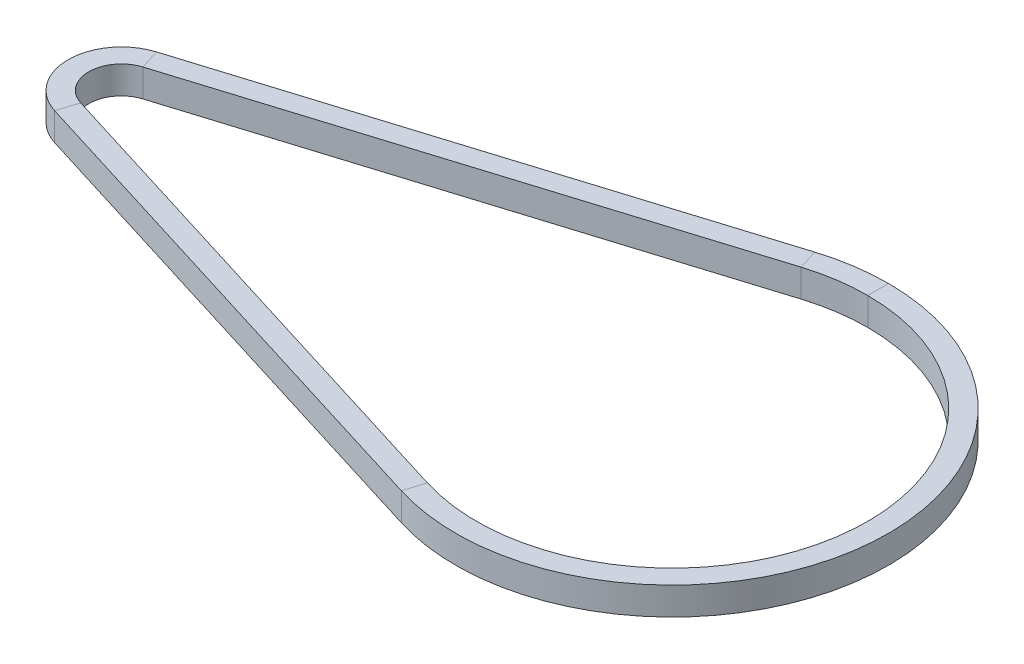
ISO-10303-21;
HEADER;
FILE_DESCRIPTION(('STEP AP214'),'2;1');
FILE_NAME('part.step','',(''),(''),'','','');
FILE_SCHEMA(('AUTOMOTIVE_DESIGN { 1 0 10303 214 1 1 1 1 }'));
ENDSEC;
DATA;
#1=APPLICATION_CONTEXT('core data for automotive mechanical design processes');
#2=APPLICATION_PROTOCOL_DEFINITION('international standard','automotive_design',2000,#1);
#3=PRODUCT_CONTEXT('',#1,'mechanical');
#4=PRODUCT('Part','Part','',(#3));
#5=PRODUCT_RELATED_PRODUCT_CATEGORY('part','',(#4));
#6=PRODUCT_DEFINITION_FORMATION('','',#4);
#7=PRODUCT_DEFINITION_CONTEXT('part definition',#1,'design');
#8=PRODUCT_DEFINITION('design','',#6,#7);
#9=PRODUCT_DEFINITION_SHAPE('','',#8);
#10=(LENGTH_UNIT() NAMED_UNIT(*) SI_UNIT(.MILLI.,.METRE.));
#11=(NAMED_UNIT(*) PLANE_ANGLE_UNIT() SI_UNIT($,.RADIAN.));
#12=(NAMED_UNIT(*) SI_UNIT($,.STERADIAN.) SOLID_ANGLE_UNIT());
#13=UNCERTAINTY_MEASURE_WITH_UNIT(LENGTH_MEASURE(1.E-05),#10,'distance_accuracy_value','');
#14=(GEOMETRIC_REPRESENTATION_CONTEXT(3) GLOBAL_UNCERTAINTY_ASSIGNED_CONTEXT((#13)) GLOBAL_UNIT_ASSIGNED_CONTEXT((#10,
#11,#12)) REPRESENTATION_CONTEXT('',''));
#15=CARTESIAN_POINT('',(0.,0.,0.));
#16=DIRECTION('',(0.,0.,1.));
#17=DIRECTION('',(1.,0.,0.));
#18=AXIS2_PLACEMENT_3D('',#15,#16,#17);
#19=CARTESIAN_POINT('',(70.2498163522013,-2.,-29.8390968777877));
#20=DIRECTION('',(0.,-1.,0.));
#21=DIRECTION('',(0.,0.,-1.));
#22=AXIS2_PLACEMENT_3D('',#19,#20,#21);
#23=PLANE('',#22);
#24=CARTESIAN_POINT('',(79.5,-2.,0.));
#25=DIRECTION('',(0.,-1.,0.));
#26=DIRECTION('',(-0.296100628930817,0.,-0.955156750249285));
#27=AXIS2_PLACEMENT_3D('',#24,#25,#26);
#28=CIRCLE('',#27,28.24);
#29=CARTESIAN_POINT('',(71.1381182389937,-2.,-26.9736266270398));
#30=VERTEX_POINT('',#29);
#31=CARTESIAN_POINT('',(79.5,-2.,-28.24));
#32=VERTEX_POINT('',#31);
#33=EDGE_CURVE('E11',#30,#32,#28,.T.);
#34=ORIENTED_EDGE('',*,*,#33,.F.);
#35=DIRECTION('',(-0.296100628930818,0.,-0.955156750249285));
#36=VECTOR('',#35,1.);
#37=CARTESIAN_POINT('',(70.2498163522013,-2.,-29.8390968777877));
#38=LINE('',#37,#36);
#39=CARTESIAN_POINT('',(70.2498163522013,-2.,-29.8390968777877));
#40=VERTEX_POINT('',#39);
#41=EDGE_CURVE('E36',#30,#40,#38,.T.);
#42=ORIENTED_EDGE('',*,*,#41,.T.);
#43=CARTESIAN_POINT('',(79.5,-2.,0.));
#44=DIRECTION('',(0.,-1.,0.));
#45=DIRECTION('',(-0.296100628930817,0.,-0.955156750249285));
#46=AXIS2_PLACEMENT_3D('',#43,#44,#45);
#47=CIRCLE('',#46,31.24);
#48=CARTESIAN_POINT('',(79.5,-2.,-31.24));
#49=VERTEX_POINT('',#48);
#50=EDGE_CURVE('E133',#40,#49,#47,.T.);
#51=ORIENTED_EDGE('',*,*,#50,.T.);
#52=DIRECTION('',(0.,0.,-1.));
#53=VECTOR('',#52,1.);
#54=CARTESIAN_POINT('',(79.5,-2.,-31.24));
#55=LINE('',#54,#53);
#56=EDGE_CURVE('E136',#32,#49,#55,.T.);
#57=ORIENTED_EDGE('',*,*,#56,.F.);
#58=EDGE_LOOP('',(#34,#42,#51,#57));
#59=FACE_BOUND('',#58,.T.);
#60=ADVANCED_FACE('F33',(#59),#23,.T.);
#61=CARTESIAN_POINT('',(79.5,0.,0.));
#62=DIRECTION('',(0.,-1.,0.));
#63=DIRECTION('',(0.,0.,-1.));
#64=AXIS2_PLACEMENT_3D('',#61,#62,#63);
#65=CYLINDRICAL_SURFACE('',#64,28.24);
#66=CARTESIAN_POINT('',(79.5,2.,0.));
#67=DIRECTION('',(0.,-1.,0.));
#68=DIRECTION('',(-0.296100628930817,0.,-0.955156750249285));
#69=AXIS2_PLACEMENT_3D('',#66,#67,#68);
#70=CIRCLE('',#69,28.24);
#71=CARTESIAN_POINT('',(71.1381182389937,2.,-26.9736266270398));
#72=VERTEX_POINT('',#71);
#73=CARTESIAN_POINT('',(79.5,2.,-28.24));
#74=VERTEX_POINT('',#73);
#75=EDGE_CURVE('E41',#72,#74,#70,.T.);
#76=ORIENTED_EDGE('',*,*,#75,.F.);
#77=DIRECTION('',(0.,-1.,0.));
#78=VECTOR('',#77,1.);
#79=CARTESIAN_POINT('',(71.1381182389937,-2.,-26.9736266270398));
#80=LINE('',#79,#78);
#81=EDGE_CURVE('E219',#72,#30,#80,.T.);
#82=ORIENTED_EDGE('',*,*,#81,.T.);
#83=ORIENTED_EDGE('',*,*,#33,.T.);
#84=DIRECTION('',(0.,-1.,0.));
#85=VECTOR('',#84,1.);
#86=CARTESIAN_POINT('',(79.5,-2.,-28.24));
#87=LINE('',#86,#85);
#88=EDGE_CURVE('E160',#74,#32,#87,.T.);
#89=ORIENTED_EDGE('',*,*,#88,.F.);
#90=EDGE_LOOP('',(#76,#82,#83,#89));
#91=FACE_BOUND('',#90,.T.);
#92=ADVANCED_FACE('F265',(#91),#65,.F.);
#93=CARTESIAN_POINT('',(70.2498163522013,2.,-29.8390968777877));
#94=DIRECTION('',(0.,1.,0.));
#95=DIRECTION('',(0.,0.,1.));
#96=AXIS2_PLACEMENT_3D('',#93,#94,#95);
#97=PLANE('',#96);
#98=CARTESIAN_POINT('',(79.5,2.,0.));
#99=DIRECTION('',(0.,-1.,0.));
#100=DIRECTION('',(-0.296100628930817,0.,-0.955156750249285));
#101=AXIS2_PLACEMENT_3D('',#98,#99,#100);
#102=CIRCLE('',#101,31.24);
#103=CARTESIAN_POINT('',(70.2498163522013,2.,-29.8390968777877));
#104=VERTEX_POINT('',#103);
#105=CARTESIAN_POINT('',(79.5,2.,-31.24));
#106=VERTEX_POINT('',#105);
#107=EDGE_CURVE('E142',#104,#106,#102,.T.);
#108=ORIENTED_EDGE('',*,*,#107,.F.);
#109=DIRECTION('',(0.296100628930818,0.,0.955156750249285));
#110=VECTOR('',#109,1.);
#111=CARTESIAN_POINT('',(70.2498163522013,2.,-29.8390968777877));
#112=LINE('',#111,#110);
#113=EDGE_CURVE('E197',#104,#72,#112,.T.);
#114=ORIENTED_EDGE('',*,*,#113,.T.);
#115=ORIENTED_EDGE('',*,*,#75,.T.);
#116=DIRECTION('',(0.,0.,1.));
#117=VECTOR('',#116,1.);
#118=CARTESIAN_POINT('',(79.5,2.,-31.24));
#119=LINE('',#118,#117);
#120=EDGE_CURVE('E164',#106,#74,#119,.T.);
#121=ORIENTED_EDGE('',*,*,#120,.F.);
#122=EDGE_LOOP('',(#108,#114,#115,#121));
#123=FACE_BOUND('',#122,.T.);
#124=ADVANCED_FACE('F269',(#123),#97,.T.);
#125=CARTESIAN_POINT('',(-2.27997484276729,-2.,-7.35470697691949));
#126=DIRECTION('',(0.,-1.,0.));
#127=DIRECTION('',(0.,0.,-1.));
#128=AXIS2_PLACEMENT_3D('',#125,#126,#127);
#129=PLANE('',#128);
#130=ORIENTED_EDGE('',*,*,#41,.F.);
#131=DIRECTION('',(0.955156750249285,0.,-0.296100628930818));
#132=VECTOR('',#131,1.);
#133=CARTESIAN_POINT('',(-1.39167295597484,-2.,-4.48923672617164));
#134=LINE('',#133,#132);
#135=CARTESIAN_POINT('',(-1.39167295597484,-2.,-4.48923672617163));
#136=VERTEX_POINT('',#135);
#137=EDGE_CURVE('E82',#136,#30,#134,.T.);
#138=ORIENTED_EDGE('',*,*,#137,.F.);
#139=DIRECTION('',(-0.296100628930818,0.,-0.955156750249285));
#140=VECTOR('',#139,1.);
#141=CARTESIAN_POINT('',(-2.27997484276729,-2.,-7.35470697691949));
#142=LINE('',#141,#140);
#143=CARTESIAN_POINT('',(-2.27997484276729,-2.,-7.35470697691949));
#144=VERTEX_POINT('',#143);
#145=EDGE_CURVE('E200',#136,#144,#142,.T.);
#146=ORIENTED_EDGE('',*,*,#145,.T.);
#147=DIRECTION('',(0.955156750249285,0.,-0.296100628930818));
#148=VECTOR('',#147,1.);
#149=CARTESIAN_POINT('',(-2.27997484276729,-2.,-7.35470697691949));
#150=LINE('',#149,#148);
#151=EDGE_CURVE('E195',#144,#40,#150,.T.);
#152=ORIENTED_EDGE('',*,*,#151,.T.);
#153=EDGE_LOOP('',(#130,#138,#146,#152));
#154=FACE_BOUND('',#153,.T.);
#155=ADVANCED_FACE('F238',(#154),#129,.T.);
#156=CARTESIAN_POINT('',(-1.39167295597484,-2.,-4.48923672617164));
#157=DIRECTION('',(0.296100628930818,0.,0.955156750249285));
#158=DIRECTION('',(0.955156750249285,0.,-0.296100628930818));
#159=AXIS2_PLACEMENT_3D('',#156,#157,#158);
#160=PLANE('',#159);
#161=ORIENTED_EDGE('',*,*,#137,.T.);
#162=ORIENTED_EDGE('',*,*,#81,.F.);
#163=DIRECTION('',(0.955156750249285,0.,-0.296100628930818));
#164=VECTOR('',#163,1.);
#165=CARTESIAN_POINT('',(-1.39167295597484,2.,-4.48923672617164));
#166=LINE('',#165,#164);
#167=CARTESIAN_POINT('',(-1.39167295597484,2.,-4.48923672617163));
#168=VERTEX_POINT('',#167);
#169=EDGE_CURVE('E91',#168,#72,#166,.T.);
#170=ORIENTED_EDGE('',*,*,#169,.F.);
#171=DIRECTION('',(0.,-1.,0.));
#172=VECTOR('',#171,1.);
#173=CARTESIAN_POINT('',(-1.39167295597484,-2.,-4.48923672617163));
#174=LINE('',#173,#172);
#175=EDGE_CURVE('E215',#168,#136,#174,.T.);
#176=ORIENTED_EDGE('',*,*,#175,.T.);
#177=EDGE_LOOP('',(#161,#162,#170,#176));
#178=FACE_BOUND('',#177,.T.);
#179=ADVANCED_FACE('F266',(#178),#160,.T.);
#180=CARTESIAN_POINT('',(-2.27997484276729,2.,-7.35470697691949));
#181=DIRECTION('',(0.,1.,0.));
#182=DIRECTION('',(0.,0.,1.));
#183=AXIS2_PLACEMENT_3D('',#180,#181,#182);
#184=PLANE('',#183);
#185=ORIENTED_EDGE('',*,*,#169,.T.);
#186=ORIENTED_EDGE('',*,*,#113,.F.);
#187=DIRECTION('',(0.955156750249285,0.,-0.296100628930818));
#188=VECTOR('',#187,1.);
#189=CARTESIAN_POINT('',(-2.27997484276729,2.,-7.35470697691949));
#190=LINE('',#189,#188);
#191=CARTESIAN_POINT('',(-2.27997484276729,2.,-7.35470697691949));
#192=VERTEX_POINT('',#191);
#193=EDGE_CURVE('E99',#192,#104,#190,.T.);
#194=ORIENTED_EDGE('',*,*,#193,.F.);
#195=DIRECTION('',(0.296100628930818,0.,0.955156750249285));
#196=VECTOR('',#195,1.);
#197=CARTESIAN_POINT('',(-2.27997484276729,2.,-7.35470697691949));
#198=LINE('',#197,#196);
#199=EDGE_CURVE('E189',#192,#168,#198,.T.);
#200=ORIENTED_EDGE('',*,*,#199,.T.);
#201=EDGE_LOOP('',(#185,#186,#194,#200));
#202=FACE_BOUND('',#201,.T.);
#203=ADVANCED_FACE('F267',(#202),#184,.T.);
#204=CARTESIAN_POINT('',(-2.27997484276729,-2.,-7.35470697691949));
#205=DIRECTION('',(-0.296100628930818,0.,-0.955156750249285));
#206=DIRECTION('',(-0.955156750249285,0.,0.296100628930818));
#207=AXIS2_PLACEMENT_3D('',#204,#205,#206);
#208=PLANE('',#207);
#209=ORIENTED_EDGE('',*,*,#193,.T.);
#210=DIRECTION('',(0.,1.,0.));
#211=VECTOR('',#210,1.);
#212=CARTESIAN_POINT('',(70.2498163522013,-2.,-29.8390968777877));
#213=LINE('',#212,#211);
#214=EDGE_CURVE('E193',#40,#104,#213,.T.);
#215=ORIENTED_EDGE('',*,*,#214,.F.);
#216=ORIENTED_EDGE('',*,*,#151,.F.);
#217=DIRECTION('',(0.,1.,0.));
#218=VECTOR('',#217,1.);
#219=CARTESIAN_POINT('',(-2.27997484276729,-2.,-7.35470697691949));
#220=LINE('',#219,#218);
#221=EDGE_CURVE('E182',#144,#192,#220,.T.);
#222=ORIENTED_EDGE('',*,*,#221,.T.);
#223=EDGE_LOOP('',(#209,#215,#216,#222));
#224=FACE_BOUND('',#223,.T.);
#225=ADVANCED_FACE('F313',(#224),#208,.T.);
#226=CARTESIAN_POINT('',(-2.27997484276729,-2.,7.35470697691949));
#227=DIRECTION('',(0.,-1.,0.));
#228=DIRECTION('',(0.,0.,-1.));
#229=AXIS2_PLACEMENT_3D('',#226,#227,#228);
#230=PLANE('',#229);
#231=ORIENTED_EDGE('',*,*,#145,.F.);
#232=CARTESIAN_POINT('',(0.,-2.,0.));
#233=DIRECTION('',(0.,-1.,0.));
#234=DIRECTION('',(-0.296100628930817,0.,0.955156750249285));
#235=AXIS2_PLACEMENT_3D('',#232,#233,#234);
#236=CIRCLE('',#235,4.7);
#237=CARTESIAN_POINT('',(-1.39167295597484,-2.,4.48923672617164));
#238=VERTEX_POINT('',#237);
#239=EDGE_CURVE('E229',#238,#136,#236,.T.);
#240=ORIENTED_EDGE('',*,*,#239,.F.);
#241=DIRECTION('',(-0.296100628930818,0.,0.955156750249285));
#242=VECTOR('',#241,1.);
#243=CARTESIAN_POINT('',(-2.27997484276729,-2.,7.35470697691949));
#244=LINE('',#243,#242);
#245=CARTESIAN_POINT('',(-2.27997484276729,-2.,7.3547069769195));
#246=VERTEX_POINT('',#245);
#247=EDGE_CURVE('E192',#238,#246,#244,.T.);
#248=ORIENTED_EDGE('',*,*,#247,.T.);
#249=CARTESIAN_POINT('',(0.,-2.,0.));
#250=DIRECTION('',(0.,-1.,0.));
#251=DIRECTION('',(-0.296100628930817,0.,0.955156750249285));
#252=AXIS2_PLACEMENT_3D('',#249,#250,#251);
#253=CIRCLE('',#252,7.69999999999999);
#254=EDGE_CURVE('E186',#246,#144,#253,.T.);
#255=ORIENTED_EDGE('',*,*,#254,.T.);
#256=EDGE_LOOP('',(#231,#240,#248,#255));
#257=FACE_BOUND('',#256,.T.);
#258=ADVANCED_FACE('F245',(#257),#230,.T.);
#259=CARTESIAN_POINT('',(0.,0.,0.));
#260=DIRECTION('',(0.,-1.,0.));
#261=DIRECTION('',(0.,0.,-1.));
#262=AXIS2_PLACEMENT_3D('',#259,#260,#261);
#263=CYLINDRICAL_SURFACE('',#262,4.7);
#264=ORIENTED_EDGE('',*,*,#239,.T.);
#265=ORIENTED_EDGE('',*,*,#175,.F.);
#266=CARTESIAN_POINT('',(0.,2.,0.));
#267=DIRECTION('',(0.,-1.,0.));
#268=DIRECTION('',(-0.296100628930817,0.,0.955156750249285));
#269=AXIS2_PLACEMENT_3D('',#266,#267,#268);
#270=CIRCLE('',#269,4.7);
#271=CARTESIAN_POINT('',(-1.39167295597484,2.,4.48923672617164));
#272=VERTEX_POINT('',#271);
#273=EDGE_CURVE('E212',#272,#168,#270,.T.);
#274=ORIENTED_EDGE('',*,*,#273,.F.);
#275=DIRECTION('',(0.,-1.,0.));
#276=VECTOR('',#275,1.);
#277=CARTESIAN_POINT('',(-1.39167295597484,-2.,4.48923672617164));
#278=LINE('',#277,#276);
#279=EDGE_CURVE('E209',#272,#238,#278,.T.);
#280=ORIENTED_EDGE('',*,*,#279,.T.);
#281=EDGE_LOOP('',(#264,#265,#274,#280));
#282=FACE_BOUND('',#281,.T.);
#283=ADVANCED_FACE('F329',(#282),#263,.F.);
#284=CARTESIAN_POINT('',(-2.27997484276729,2.,7.35470697691949));
#285=DIRECTION('',(0.,1.,0.));
#286=DIRECTION('',(0.,0.,1.));
#287=AXIS2_PLACEMENT_3D('',#284,#285,#286);
#288=PLANE('',#287);
#289=ORIENTED_EDGE('',*,*,#273,.T.);
#290=ORIENTED_EDGE('',*,*,#199,.F.);
#291=CARTESIAN_POINT('',(0.,2.,0.));
#292=DIRECTION('',(0.,-1.,0.));
#293=DIRECTION('',(-0.296100628930817,0.,0.955156750249285));
#294=AXIS2_PLACEMENT_3D('',#291,#292,#293);
#295=CIRCLE('',#294,7.69999999999999);
#296=CARTESIAN_POINT('',(-2.27997484276729,2.,7.3547069769195));
#297=VERTEX_POINT('',#296);
#298=EDGE_CURVE('E185',#297,#192,#295,.T.);
#299=ORIENTED_EDGE('',*,*,#298,.F.);
#300=DIRECTION('',(0.296100628930818,0.,-0.955156750249285));
#301=VECTOR('',#300,1.);
#302=CARTESIAN_POINT('',(-2.27997484276729,2.,7.35470697691949));
#303=LINE('',#302,#301);
#304=EDGE_CURVE('E176',#297,#272,#303,.T.);
#305=ORIENTED_EDGE('',*,*,#304,.T.);
#306=EDGE_LOOP('',(#289,#290,#299,#305));
#307=FACE_BOUND('',#306,.T.);
#308=ADVANCED_FACE('F259',(#307),#288,.T.);
#309=CARTESIAN_POINT('',(0.,0.,0.));
#310=DIRECTION('',(0.,-1.,0.));
#311=DIRECTION('',(0.,0.,-1.));
#312=AXIS2_PLACEMENT_3D('',#309,#310,#311);
#313=CYLINDRICAL_SURFACE('',#312,7.69999999999999);
#314=ORIENTED_EDGE('',*,*,#298,.T.);
#315=ORIENTED_EDGE('',*,*,#221,.F.);
#316=ORIENTED_EDGE('',*,*,#254,.F.);
#317=DIRECTION('',(0.,1.,0.));
#318=VECTOR('',#317,1.);
#319=CARTESIAN_POINT('',(-2.27997484276729,-2.,7.35470697691949));
#320=LINE('',#319,#318);
#321=EDGE_CURVE('E173',#246,#297,#320,.T.);
#322=ORIENTED_EDGE('',*,*,#321,.T.);
#323=EDGE_LOOP('',(#314,#315,#316,#322));
#324=FACE_BOUND('',#323,.T.);
#325=ADVANCED_FACE('F243',(#324),#313,.T.);
#326=CARTESIAN_POINT('',(70.2498163522013,-2.,29.8390968777877));
#327=DIRECTION('',(0.,-1.,0.));
#328=DIRECTION('',(0.,0.,-1.));
#329=AXIS2_PLACEMENT_3D('',#326,#327,#328);
#330=PLANE('',#329);
#331=ORIENTED_EDGE('',*,*,#247,.F.);
#332=DIRECTION('',(-0.955156750249285,0.,-0.296100628930818));
#333=VECTOR('',#332,1.);
#334=CARTESIAN_POINT('',(71.1381182389937,-2.,26.9736266270398));
#335=LINE('',#334,#333);
#336=CARTESIAN_POINT('',(71.1381182389937,-2.,26.9736266270398));
#337=VERTEX_POINT('',#336);
#338=EDGE_CURVE('E177',#337,#238,#335,.T.);
#339=ORIENTED_EDGE('',*,*,#338,.F.);
#340=DIRECTION('',(-0.296100628930817,0.,0.955156750249285));
#341=VECTOR('',#340,1.);
#342=CARTESIAN_POINT('',(70.2498163522013,-2.,29.8390968777877));
#343=LINE('',#342,#341);
#344=CARTESIAN_POINT('',(70.2498163522013,-2.,29.8390968777877));
#345=VERTEX_POINT('',#344);
#346=EDGE_CURVE('E181',#337,#345,#343,.T.);
#347=ORIENTED_EDGE('',*,*,#346,.T.);
#348=DIRECTION('',(-0.955156750249285,0.,-0.296100628930818));
#349=VECTOR('',#348,1.);
#350=CARTESIAN_POINT('',(70.2498163522013,-2.,29.8390968777877));
#351=LINE('',#350,#349);
#352=EDGE_CURVE('E179',#345,#246,#351,.T.);
#353=ORIENTED_EDGE('',*,*,#352,.T.);
#354=EDGE_LOOP('',(#331,#339,#347,#353));
#355=FACE_BOUND('',#354,.T.);
#356=ADVANCED_FACE('F249',(#355),#330,.T.);
#357=CARTESIAN_POINT('',(71.1381182389937,-2.,26.9736266270398));
#358=DIRECTION('',(0.296100628930818,0.,-0.955156750249285));
#359=DIRECTION('',(-0.955156750249285,0.,-0.296100628930818));
#360=AXIS2_PLACEMENT_3D('',#357,#358,#359);
#361=PLANE('',#360);
#362=ORIENTED_EDGE('',*,*,#338,.T.);
#363=ORIENTED_EDGE('',*,*,#279,.F.);
#364=DIRECTION('',(-0.955156750249285,0.,-0.296100628930818));
#365=VECTOR('',#364,1.);
#366=CARTESIAN_POINT('',(71.1381182389937,2.,26.9736266270398));
#367=LINE('',#366,#365);
#368=CARTESIAN_POINT('',(71.1381182389937,2.,26.9736266270398));
#369=VERTEX_POINT('',#368);
#370=EDGE_CURVE('E114',#369,#272,#367,.T.);
#371=ORIENTED_EDGE('',*,*,#370,.F.);
#372=DIRECTION('',(0.,-1.,0.));
#373=VECTOR('',#372,1.);
#374=CARTESIAN_POINT('',(71.1381182389937,-2.,26.9736266270398));
#375=LINE('',#374,#373);
#376=EDGE_CURVE('E206',#369,#337,#375,.T.);
#377=ORIENTED_EDGE('',*,*,#376,.T.);
#378=EDGE_LOOP('',(#362,#363,#371,#377));
#379=FACE_BOUND('',#378,.T.);
#380=ADVANCED_FACE('F255',(#379),#361,.T.);
#381=CARTESIAN_POINT('',(70.2498163522013,2.,29.8390968777877));
#382=DIRECTION('',(0.,1.,0.));
#383=DIRECTION('',(0.,0.,1.));
#384=AXIS2_PLACEMENT_3D('',#381,#382,#383);
#385=PLANE('',#384);
#386=ORIENTED_EDGE('',*,*,#370,.T.);
#387=ORIENTED_EDGE('',*,*,#304,.F.);
#388=DIRECTION('',(-0.955156750249285,0.,-0.296100628930818));
#389=VECTOR('',#388,1.);
#390=CARTESIAN_POINT('',(70.2498163522013,2.,29.8390968777877));
#391=LINE('',#390,#389);
#392=CARTESIAN_POINT('',(70.2498163522013,2.,29.8390968777877));
#393=VERTEX_POINT('',#392);
#394=EDGE_CURVE('E121',#393,#297,#391,.T.);
#395=ORIENTED_EDGE('',*,*,#394,.F.);
#396=DIRECTION('',(0.296100628930817,0.,-0.955156750249285));
#397=VECTOR('',#396,1.);
#398=CARTESIAN_POINT('',(70.2498163522013,2.,29.8390968777877));
#399=LINE('',#398,#397);
#400=EDGE_CURVE('E171',#393,#369,#399,.T.);
#401=ORIENTED_EDGE('',*,*,#400,.T.);
#402=EDGE_LOOP('',(#386,#387,#395,#401));
#403=FACE_BOUND('',#402,.T.);
#404=ADVANCED_FACE('F260',(#403),#385,.T.);
#405=CARTESIAN_POINT('',(70.2498163522013,-2.,29.8390968777877));
#406=DIRECTION('',(-0.296100628930818,0.,0.955156750249285));
#407=DIRECTION('',(0.955156750249285,0.,0.296100628930818));
#408=AXIS2_PLACEMENT_3D('',#405,#406,#407);
#409=PLANE('',#408);
#410=ORIENTED_EDGE('',*,*,#394,.T.);
#411=ORIENTED_EDGE('',*,*,#321,.F.);
#412=ORIENTED_EDGE('',*,*,#352,.F.);
#413=DIRECTION('',(0.,1.,0.));
#414=VECTOR('',#413,1.);
#415=CARTESIAN_POINT('',(70.2498163522013,-2.,29.8390968777877));
#416=LINE('',#415,#414);
#417=EDGE_CURVE('E152',#345,#393,#416,.T.);
#418=ORIENTED_EDGE('',*,*,#417,.T.);
#419=EDGE_LOOP('',(#410,#411,#412,#418));
#420=FACE_BOUND('',#419,.T.);
#421=ADVANCED_FACE('F248',(#420),#409,.T.);
#422=CARTESIAN_POINT('',(79.5,-2.,-31.24));
#423=DIRECTION('',(0.,-1.,0.));
#424=DIRECTION('',(0.,0.,-1.));
#425=AXIS2_PLACEMENT_3D('',#422,#423,#424);
#426=PLANE('',#425);
#427=ORIENTED_EDGE('',*,*,#346,.F.);
#428=CARTESIAN_POINT('',(79.5,-2.,0.));
#429=DIRECTION('',(0.,-1.,0.));
#430=DIRECTION('',(0.,0.,-1.));
#431=AXIS2_PLACEMENT_3D('',#428,#429,#430);
#432=CIRCLE('',#431,28.24);
#433=EDGE_CURVE('E159',#32,#337,#432,.T.);
#434=ORIENTED_EDGE('',*,*,#433,.F.);
#435=ORIENTED_EDGE('',*,*,#56,.T.);
#436=CARTESIAN_POINT('',(79.5,-2.,0.));
#437=DIRECTION('',(0.,-1.,0.));
#438=DIRECTION('',(0.,0.,-1.));
#439=AXIS2_PLACEMENT_3D('',#436,#437,#438);
#440=CIRCLE('',#439,31.24);
#441=EDGE_CURVE('E148',#49,#345,#440,.T.);
#442=ORIENTED_EDGE('',*,*,#441,.T.);
#443=EDGE_LOOP('',(#427,#434,#435,#442));
#444=FACE_BOUND('',#443,.T.);
#445=ADVANCED_FACE('F157',(#444),#426,.T.);
#446=CARTESIAN_POINT('',(79.5,0.,0.));
#447=DIRECTION('',(0.,-1.,0.));
#448=DIRECTION('',(0.,0.,-1.));
#449=AXIS2_PLACEMENT_3D('',#446,#447,#448);
#450=CYLINDRICAL_SURFACE('',#449,28.24);
#451=ORIENTED_EDGE('',*,*,#433,.T.);
#452=ORIENTED_EDGE('',*,*,#376,.F.);
#453=CARTESIAN_POINT('',(79.5,2.,0.));
#454=DIRECTION('',(0.,-1.,0.));
#455=DIRECTION('',(0.,0.,-1.));
#456=AXIS2_PLACEMENT_3D('',#453,#454,#455);
#457=CIRCLE('',#456,28.24);
#458=EDGE_CURVE('E203',#74,#369,#457,.T.);
#459=ORIENTED_EDGE('',*,*,#458,.F.);
#460=ORIENTED_EDGE('',*,*,#88,.T.);
#461=EDGE_LOOP('',(#451,#452,#459,#460));
#462=FACE_BOUND('',#461,.T.);
#463=ADVANCED_FACE('F252',(#462),#450,.F.);
#464=CARTESIAN_POINT('',(79.5,2.,-31.24));
#465=DIRECTION('',(0.,1.,0.));
#466=DIRECTION('',(0.,0.,1.));
#467=AXIS2_PLACEMENT_3D('',#464,#465,#466);
#468=PLANE('',#467);
#469=ORIENTED_EDGE('',*,*,#458,.T.);
#470=ORIENTED_EDGE('',*,*,#400,.F.);
#471=CARTESIAN_POINT('',(79.5,2.,0.));
#472=DIRECTION('',(0.,-1.,0.));
#473=DIRECTION('',(0.,0.,-1.));
#474=AXIS2_PLACEMENT_3D('',#471,#472,#473);
#475=CIRCLE('',#474,31.24);
#476=EDGE_CURVE('E170',#106,#393,#475,.T.);
#477=ORIENTED_EDGE('',*,*,#476,.F.);
#478=ORIENTED_EDGE('',*,*,#120,.T.);
#479=EDGE_LOOP('',(#469,#470,#477,#478));
#480=FACE_BOUND('',#479,.T.);
#481=ADVANCED_FACE('F263',(#480),#468,.T.);
#482=CARTESIAN_POINT('',(79.5,0.,0.));
#483=DIRECTION('',(0.,-1.,0.));
#484=DIRECTION('',(0.,0.,-1.));
#485=AXIS2_PLACEMENT_3D('',#482,#483,#484);
#486=CYLINDRICAL_SURFACE('',#485,31.24);
#487=ORIENTED_EDGE('',*,*,#476,.T.);
#488=ORIENTED_EDGE('',*,*,#417,.F.);
#489=ORIENTED_EDGE('',*,*,#441,.F.);
#490=DIRECTION('',(0.,1.,0.));
#491=VECTOR('',#490,1.);
#492=CARTESIAN_POINT('',(79.5,-2.,-31.24));
#493=LINE('',#492,#491);
#494=EDGE_CURVE('E151',#49,#106,#493,.T.);
#495=ORIENTED_EDGE('',*,*,#494,.T.);
#496=EDGE_LOOP('',(#487,#488,#489,#495));
#497=FACE_BOUND('',#496,.T.);
#498=ADVANCED_FACE('F150',(#497),#486,.T.);
#499=CARTESIAN_POINT('',(79.5,0.,0.));
#500=DIRECTION('',(0.,-1.,0.));
#501=DIRECTION('',(0.,0.,-1.));
#502=AXIS2_PLACEMENT_3D('',#499,#500,#501);
#503=CYLINDRICAL_SURFACE('',#502,31.24);
#504=ORIENTED_EDGE('',*,*,#214,.T.);
#505=ORIENTED_EDGE('',*,*,#107,.T.);
#506=ORIENTED_EDGE('',*,*,#494,.F.);
#507=ORIENTED_EDGE('',*,*,#50,.F.);
#508=EDGE_LOOP('',(#504,#505,#506,#507));
#509=FACE_BOUND('',#508,.T.);
#510=ADVANCED_FACE('F162',(#509),#503,.T.);
#511=CLOSED_SHELL('',(#60,#92,#124,#155,#179,#203,#225,#258,#283,#308,#325,#356,#380,#404,#421,
#445,#463,#481,#498,#510));
#512=MANIFOLD_SOLID_BREP('B2',#511);
#513=ADVANCED_BREP_SHAPE_REPRESENTATION('',(#18,#512),#14);
#514=SHAPE_DEFINITION_REPRESENTATION(#9,#513);
ENDSEC;
END-ISO-10303-21;
